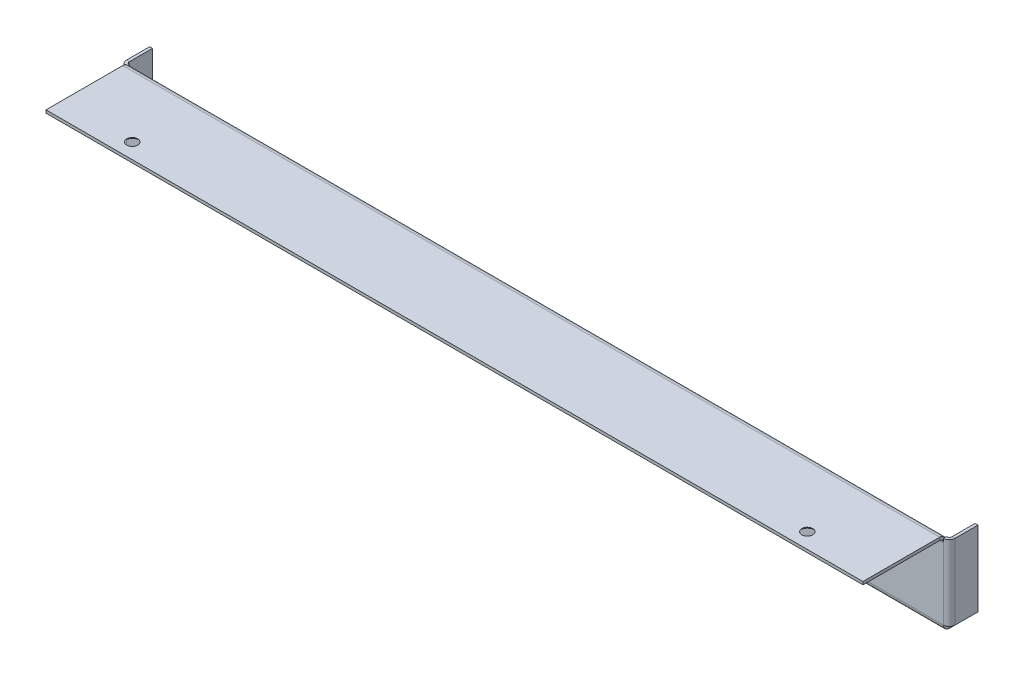
ISO-10303-21;
HEADER;
FILE_DESCRIPTION(('STEP AP214'),'2;1');
FILE_NAME('part.step','',(''),(''),'','','');
FILE_SCHEMA(('AUTOMOTIVE_DESIGN { 1 0 10303 214 1 1 1 1 }'));
ENDSEC;
DATA;
#1=APPLICATION_CONTEXT('core data for automotive mechanical design processes');
#2=APPLICATION_PROTOCOL_DEFINITION('international standard','automotive_design',2000,#1);
#3=PRODUCT_CONTEXT('',#1,'mechanical');
#4=PRODUCT('Part','Part','',(#3));
#5=PRODUCT_RELATED_PRODUCT_CATEGORY('part','',(#4));
#6=PRODUCT_DEFINITION_FORMATION('','',#4);
#7=PRODUCT_DEFINITION_CONTEXT('part definition',#1,'design');
#8=PRODUCT_DEFINITION('design','',#6,#7);
#9=PRODUCT_DEFINITION_SHAPE('','',#8);
#10=(LENGTH_UNIT() NAMED_UNIT(*) SI_UNIT(.MILLI.,.METRE.));
#11=(NAMED_UNIT(*) PLANE_ANGLE_UNIT() SI_UNIT($,.RADIAN.));
#12=(NAMED_UNIT(*) SI_UNIT($,.STERADIAN.) SOLID_ANGLE_UNIT());
#13=UNCERTAINTY_MEASURE_WITH_UNIT(LENGTH_MEASURE(1.E-05),#10,'distance_accuracy_value','');
#14=(GEOMETRIC_REPRESENTATION_CONTEXT(3) GLOBAL_UNCERTAINTY_ASSIGNED_CONTEXT((#13)) GLOBAL_UNIT_ASSIGNED_CONTEXT((#10,
#11,#12)) REPRESENTATION_CONTEXT('',''));
#15=CARTESIAN_POINT('',(0.,0.,0.));
#16=DIRECTION('',(0.,0.,1.));
#17=DIRECTION('',(1.,0.,0.));
#18=AXIS2_PLACEMENT_3D('',#15,#16,#17);
#19=CARTESIAN_POINT('',(0.,39.2,0.));
#20=DIRECTION('',(1.,0.,0.));
#21=DIRECTION('',(0.,1.,0.));
#22=AXIS2_PLACEMENT_3D('',#19,#20,#21);
#23=PLANE('',#22);
#24=DIRECTION('',(0.,0.,1.));
#25=VECTOR('',#24,1.);
#26=CARTESIAN_POINT('',(0.,39.2,-1.5));
#27=LINE('',#26,#25);
#28=CARTESIAN_POINT('',(0.,39.2,-1.5));
#29=VERTEX_POINT('',#28);
#30=CARTESIAN_POINT('',(0.,39.2,-0.872281323269019));
#31=VERTEX_POINT('',#30);
#32=EDGE_CURVE('E469',#29,#31,#27,.T.);
#33=ORIENTED_EDGE('',*,*,#32,.T.);
#34=CARTESIAN_POINT('',(0.,37.2,2.));
#35=DIRECTION('',(-1.,0.,0.));
#36=DIRECTION('',(0.,0.,1.));
#37=AXIS2_PLACEMENT_3D('',#34,#35,#36);
#38=CIRCLE('',#37,3.5);
#39=CARTESIAN_POINT('',(0.,37.2,-1.5));
#40=VERTEX_POINT('',#39);
#41=EDGE_CURVE('E264',#31,#40,#38,.T.);
#42=ORIENTED_EDGE('',*,*,#41,.T.);
#43=DIRECTION('',(0.,-1.,0.));
#44=VECTOR('',#43,1.);
#45=CARTESIAN_POINT('',(0.,0.,-1.5));
#46=LINE('',#45,#44);
#47=EDGE_CURVE('E449',#29,#40,#46,.T.);
#48=ORIENTED_EDGE('',*,*,#47,.F.);
#49=EDGE_LOOP('',(#33,#42,#48));
#50=FACE_BOUND('',#49,.T.);
#51=ADVANCED_FACE('F98',(#50),#23,.T.);
#52=CARTESIAN_POINT('',(426.,37.2,0.));
#53=DIRECTION('',(-1.,0.,0.));
#54=DIRECTION('',(0.,0.,1.));
#55=AXIS2_PLACEMENT_3D('',#52,#53,#54);
#56=PLANE('',#55);
#57=DIRECTION('',(0.,1.,0.));
#58=VECTOR('',#57,1.);
#59=CARTESIAN_POINT('',(426.,0.,-1.5));
#60=LINE('',#59,#58);
#61=CARTESIAN_POINT('',(426.,37.2,-1.50000000000001));
#62=VERTEX_POINT('',#61);
#63=CARTESIAN_POINT('',(426.,39.2,-1.50000000000001));
#64=VERTEX_POINT('',#63);
#65=EDGE_CURVE('E456',#62,#64,#60,.T.);
#66=ORIENTED_EDGE('',*,*,#65,.F.);
#67=CARTESIAN_POINT('',(426.,37.2,2.));
#68=DIRECTION('',(-1.,0.,0.));
#69=DIRECTION('',(0.,0.,1.));
#70=AXIS2_PLACEMENT_3D('',#67,#68,#69);
#71=CIRCLE('',#70,3.5);
#72=CARTESIAN_POINT('',(426.,39.2,-0.872281323269019));
#73=VERTEX_POINT('',#72);
#74=EDGE_CURVE('E121',#62,#73,#71,.F.);
#75=ORIENTED_EDGE('',*,*,#74,.T.);
#76=DIRECTION('',(0.,0.,1.));
#77=VECTOR('',#76,1.);
#78=CARTESIAN_POINT('',(426.,39.2,-1.5));
#79=LINE('',#78,#77);
#80=EDGE_CURVE('E471',#64,#73,#79,.T.);
#81=ORIENTED_EDGE('',*,*,#80,.F.);
#82=EDGE_LOOP('',(#66,#75,#81));
#83=FACE_BOUND('',#82,.T.);
#84=ADVANCED_FACE('F510',(#83),#56,.T.);
#85=CARTESIAN_POINT('',(0.,0.,-1.5));
#86=DIRECTION('',(0.,0.,-1.));
#87=DIRECTION('',(-1.,0.,0.));
#88=AXIS2_PLACEMENT_3D('',#85,#86,#87);
#89=PLANE('',#88);
#90=CARTESIAN_POINT('',(0.,0.,-1.49999999999999));
#91=VERTEX_POINT('',#90);
#92=EDGE_CURVE('E453',#40,#91,#46,.T.);
#93=ORIENTED_EDGE('',*,*,#92,.F.);
#94=DIRECTION('',(-1.,0.,0.));
#95=VECTOR('',#94,1.);
#96=CARTESIAN_POINT('',(0.,37.2,-1.5));
#97=LINE('',#96,#95);
#98=EDGE_CURVE('E266',#40,#62,#97,.F.);
#99=ORIENTED_EDGE('',*,*,#98,.T.);
#100=CARTESIAN_POINT('',(426.,0.,-1.50000000000001));
#101=VERTEX_POINT('',#100);
#102=EDGE_CURVE('E457',#101,#62,#60,.T.);
#103=ORIENTED_EDGE('',*,*,#102,.F.);
#104=DIRECTION('',(1.,0.,0.));
#105=VECTOR('',#104,1.);
#106=CARTESIAN_POINT('',(0.,0.,-1.5));
#107=LINE('',#106,#105);
#108=EDGE_CURVE('E452',#91,#101,#107,.T.);
#109=ORIENTED_EDGE('',*,*,#108,.F.);
#110=EDGE_LOOP('',(#93,#99,#103,#109));
#111=FACE_BOUND('',#110,.T.);
#112=ADVANCED_FACE('F516',(#111),#89,.T.);
#113=CARTESIAN_POINT('',(0.,0.,0.));
#114=DIRECTION('',(0.,0.,-1.));
#115=DIRECTION('',(-1.,0.,0.));
#116=AXIS2_PLACEMENT_3D('',#113,#114,#115);
#117=PLANE('',#116);
#118=DIRECTION('',(-1.,0.,0.));
#119=VECTOR('',#118,1.);
#120=CARTESIAN_POINT('',(0.,37.2,0.));
#121=LINE('',#120,#119);
#122=CARTESIAN_POINT('',(0.,37.2,0.));
#123=VERTEX_POINT('',#122);
#124=CARTESIAN_POINT('',(426.,37.2,0.));
#125=VERTEX_POINT('',#124);
#126=EDGE_CURVE('E317',#123,#125,#121,.F.);
#127=ORIENTED_EDGE('',*,*,#126,.F.);
#128=DIRECTION('',(0.,-1.,0.));
#129=VECTOR('',#128,1.);
#130=CARTESIAN_POINT('',(0.,0.,0.));
#131=LINE('',#130,#129);
#132=CARTESIAN_POINT('',(0.,0.,0.));
#133=VERTEX_POINT('',#132);
#134=EDGE_CURVE('E441',#123,#133,#131,.T.);
#135=ORIENTED_EDGE('',*,*,#134,.T.);
#136=DIRECTION('',(1.,0.,0.));
#137=VECTOR('',#136,1.);
#138=CARTESIAN_POINT('',(0.,0.,0.));
#139=LINE('',#138,#137);
#140=CARTESIAN_POINT('',(426.,0.,0.));
#141=VERTEX_POINT('',#140);
#142=EDGE_CURVE('E463',#133,#141,#139,.T.);
#143=ORIENTED_EDGE('',*,*,#142,.T.);
#144=DIRECTION('',(0.,1.,0.));
#145=VECTOR('',#144,1.);
#146=CARTESIAN_POINT('',(426.,0.,0.));
#147=LINE('',#146,#145);
#148=EDGE_CURVE('E466',#141,#125,#147,.T.);
#149=ORIENTED_EDGE('',*,*,#148,.T.);
#150=EDGE_LOOP('',(#127,#135,#143,#149));
#151=FACE_BOUND('',#150,.T.);
#152=ADVANCED_FACE('F625',(#151),#117,.F.);
#153=CARTESIAN_POINT('',(0.,0.,-3.));
#154=DIRECTION('',(0.,-1.,0.));
#155=DIRECTION('',(1.,0.,0.));
#156=AXIS2_PLACEMENT_3D('',#153,#154,#155);
#157=PLANE('',#156);
#158=DIRECTION('',(1.,0.,0.));
#159=VECTOR('',#158,1.);
#160=CARTESIAN_POINT('',(-3.,0.,-2.99999999999999));
#161=LINE('',#160,#159);
#162=CARTESIAN_POINT('',(-1.5,0.,-2.99999999999999));
#163=VERTEX_POINT('',#162);
#164=CARTESIAN_POINT('',(-3.,0.,-2.99999999999999));
#165=VERTEX_POINT('',#164);
#166=EDGE_CURVE('E399',#163,#165,#161,.F.);
#167=ORIENTED_EDGE('',*,*,#166,.F.);
#168=CARTESIAN_POINT('',(0.,0.,-3.));
#169=DIRECTION('',(0.,1.,0.));
#170=DIRECTION('',(-1.,0.,0.));
#171=AXIS2_PLACEMENT_3D('',#168,#169,#170);
#172=CIRCLE('',#171,1.5);
#173=EDGE_CURVE('E444',#91,#163,#172,.F.);
#174=ORIENTED_EDGE('',*,*,#173,.F.);
#175=DIRECTION('',(0.,0.,1.));
#176=VECTOR('',#175,1.);
#177=CARTESIAN_POINT('',(0.,0.,-1.5));
#178=LINE('',#177,#176);
#179=EDGE_CURVE('E460',#91,#133,#178,.T.);
#180=ORIENTED_EDGE('',*,*,#179,.T.);
#181=CARTESIAN_POINT('',(0.,0.,-3.));
#182=DIRECTION('',(0.,1.,0.));
#183=DIRECTION('',(-1.,0.,0.));
#184=AXIS2_PLACEMENT_3D('',#181,#182,#183);
#185=CIRCLE('',#184,3.);
#186=EDGE_CURVE('E438',#133,#165,#185,.F.);
#187=ORIENTED_EDGE('',*,*,#186,.T.);
#188=EDGE_LOOP('',(#167,#174,#180,#187));
#189=FACE_BOUND('',#188,.T.);
#190=ADVANCED_FACE('F622',(#189),#157,.T.);
#191=CARTESIAN_POINT('',(0.,39.2,-3.));
#192=DIRECTION('',(0.,-1.,0.));
#193=DIRECTION('',(1.,0.,0.));
#194=AXIS2_PLACEMENT_3D('',#191,#192,#193);
#195=PLANE('',#194);
#196=CARTESIAN_POINT('',(0.,39.2,-3.));
#197=DIRECTION('',(0.,1.,0.));
#198=DIRECTION('',(-1.,0.,0.));
#199=AXIS2_PLACEMENT_3D('',#196,#197,#198);
#200=CIRCLE('',#199,1.5);
#201=CARTESIAN_POINT('',(-1.5,39.2,-2.99999999999999));
#202=VERTEX_POINT('',#201);
#203=EDGE_CURVE('E411',#202,#29,#200,.T.);
#204=ORIENTED_EDGE('',*,*,#203,.F.);
#205=DIRECTION('',(1.,0.,0.));
#206=VECTOR('',#205,1.);
#207=CARTESIAN_POINT('',(-1.5,39.2,-2.99999999999999));
#208=LINE('',#207,#206);
#209=CARTESIAN_POINT('',(-3.,39.2,-2.99999999999999));
#210=VERTEX_POINT('',#209);
#211=EDGE_CURVE('E431',#202,#210,#208,.F.);
#212=ORIENTED_EDGE('',*,*,#211,.T.);
#213=CARTESIAN_POINT('',(0.,39.2,-3.));
#214=DIRECTION('',(0.,1.,0.));
#215=DIRECTION('',(-1.,0.,0.));
#216=AXIS2_PLACEMENT_3D('',#213,#214,#215);
#217=CIRCLE('',#216,3.);
#218=CARTESIAN_POINT('',(0.,39.2,0.));
#219=VERTEX_POINT('',#218);
#220=EDGE_CURVE('E442',#210,#219,#217,.T.);
#221=ORIENTED_EDGE('',*,*,#220,.T.);
#222=EDGE_CURVE('E113',#31,#219,#27,.T.);
#223=ORIENTED_EDGE('',*,*,#222,.F.);
#224=ORIENTED_EDGE('',*,*,#32,.F.);
#225=EDGE_LOOP('',(#204,#212,#221,#223,#224));
#226=FACE_BOUND('',#225,.T.);
#227=ADVANCED_FACE('F617',(#226),#195,.F.);
#228=CARTESIAN_POINT('',(0.,39.2,-3.));
#229=DIRECTION('',(0.,1.,0.));
#230=DIRECTION('',(-1.,0.,0.));
#231=AXIS2_PLACEMENT_3D('',#228,#229,#230);
#232=CYLINDRICAL_SURFACE('',#231,3.);
#233=EDGE_CURVE('E461',#219,#123,#131,.T.);
#234=ORIENTED_EDGE('',*,*,#233,.F.);
#235=ORIENTED_EDGE('',*,*,#220,.F.);
#236=DIRECTION('',(0.,1.,0.));
#237=VECTOR('',#236,1.);
#238=CARTESIAN_POINT('',(-3.,0.,-2.99999999999999));
#239=LINE('',#238,#237);
#240=EDGE_CURVE('E429',#210,#165,#239,.F.);
#241=ORIENTED_EDGE('',*,*,#240,.T.);
#242=ORIENTED_EDGE('',*,*,#186,.F.);
#243=ORIENTED_EDGE('',*,*,#134,.F.);
#244=EDGE_LOOP('',(#234,#235,#241,#242,#243));
#245=FACE_BOUND('',#244,.T.);
#246=ADVANCED_FACE('F614',(#245),#232,.T.);
#247=CARTESIAN_POINT('',(0.,39.2,-3.));
#248=DIRECTION('',(0.,1.,0.));
#249=DIRECTION('',(-1.,0.,0.));
#250=AXIS2_PLACEMENT_3D('',#247,#248,#249);
#251=CYLINDRICAL_SURFACE('',#250,1.5);
#252=ORIENTED_EDGE('',*,*,#47,.T.);
#253=ORIENTED_EDGE('',*,*,#92,.T.);
#254=ORIENTED_EDGE('',*,*,#173,.T.);
#255=DIRECTION('',(0.,1.,0.));
#256=VECTOR('',#255,1.);
#257=CARTESIAN_POINT('',(-1.5,0.,-2.99999999999999));
#258=LINE('',#257,#256);
#259=EDGE_CURVE('E434',#163,#202,#258,.T.);
#260=ORIENTED_EDGE('',*,*,#259,.T.);
#261=ORIENTED_EDGE('',*,*,#203,.T.);
#262=EDGE_LOOP('',(#252,#253,#254,#260,#261));
#263=FACE_BOUND('',#262,.T.);
#264=ADVANCED_FACE('F612',(#263),#251,.F.);
#265=CARTESIAN_POINT('',(-3.00000000000004,39.2,-15.));
#266=DIRECTION('',(0.,-1.,0.));
#267=DIRECTION('',(0.,0.,-1.));
#268=AXIS2_PLACEMENT_3D('',#265,#266,#267);
#269=PLANE('',#268);
#270=ORIENTED_EDGE('',*,*,#211,.F.);
#271=DIRECTION('',(0.,0.,1.));
#272=VECTOR('',#271,1.);
#273=CARTESIAN_POINT('',(-1.50000000000004,39.2,-15.));
#274=LINE('',#273,#272);
#275=CARTESIAN_POINT('',(-1.50000000000004,39.2,-15.));
#276=VERTEX_POINT('',#275);
#277=EDGE_CURVE('E427',#202,#276,#274,.F.);
#278=ORIENTED_EDGE('',*,*,#277,.T.);
#279=DIRECTION('',(1.,0.,0.));
#280=VECTOR('',#279,1.);
#281=CARTESIAN_POINT('',(-3.00000000000004,39.2,-15.));
#282=LINE('',#281,#280);
#283=CARTESIAN_POINT('',(-3.00000000000004,39.2,-15.));
#284=VERTEX_POINT('',#283);
#285=EDGE_CURVE('E408',#284,#276,#282,.T.);
#286=ORIENTED_EDGE('',*,*,#285,.F.);
#287=DIRECTION('',(0.,0.,-1.));
#288=VECTOR('',#287,1.);
#289=CARTESIAN_POINT('',(-2.99999999999999,39.2,0.));
#290=LINE('',#289,#288);
#291=EDGE_CURVE('E420',#210,#284,#290,.T.);
#292=ORIENTED_EDGE('',*,*,#291,.F.);
#293=EDGE_LOOP('',(#270,#278,#286,#292));
#294=FACE_BOUND('',#293,.T.);
#295=ADVANCED_FACE('F605',(#294),#269,.F.);
#296=CARTESIAN_POINT('',(-2.99999999999999,0.,-1.49999999999999));
#297=DIRECTION('',(0.,1.,0.));
#298=DIRECTION('',(0.,0.,1.));
#299=AXIS2_PLACEMENT_3D('',#296,#297,#298);
#300=PLANE('',#299);
#301=ORIENTED_EDGE('',*,*,#166,.T.);
#302=DIRECTION('',(0.,0.,1.));
#303=VECTOR('',#302,1.);
#304=CARTESIAN_POINT('',(-2.99999999999999,0.,0.));
#305=LINE('',#304,#303);
#306=CARTESIAN_POINT('',(-3.00000000000004,0.,-15.));
#307=VERTEX_POINT('',#306);
#308=EDGE_CURVE('E415',#307,#165,#305,.T.);
#309=ORIENTED_EDGE('',*,*,#308,.F.);
#310=DIRECTION('',(1.,0.,0.));
#311=VECTOR('',#310,1.);
#312=CARTESIAN_POINT('',(-3.00000000000004,0.,-15.));
#313=LINE('',#312,#311);
#314=CARTESIAN_POINT('',(-1.50000000000004,0.,-15.));
#315=VERTEX_POINT('',#314);
#316=EDGE_CURVE('E412',#307,#315,#313,.T.);
#317=ORIENTED_EDGE('',*,*,#316,.T.);
#318=DIRECTION('',(0.,0.,-1.));
#319=VECTOR('',#318,1.);
#320=CARTESIAN_POINT('',(-1.49999999999999,0.,-1.5));
#321=LINE('',#320,#319);
#322=EDGE_CURVE('E422',#315,#163,#321,.F.);
#323=ORIENTED_EDGE('',*,*,#322,.T.);
#324=EDGE_LOOP('',(#301,#309,#317,#323));
#325=FACE_BOUND('',#324,.T.);
#326=ADVANCED_FACE('F598',(#325),#300,.F.);
#327=CARTESIAN_POINT('',(-2.99999999999999,0.,0.));
#328=DIRECTION('',(1.,0.,0.));
#329=DIRECTION('',(0.,0.,-1.));
#330=AXIS2_PLACEMENT_3D('',#327,#328,#329);
#331=PLANE('',#330);
#332=ORIENTED_EDGE('',*,*,#240,.F.);
#333=ORIENTED_EDGE('',*,*,#291,.T.);
#334=DIRECTION('',(0.,-1.,0.));
#335=VECTOR('',#334,1.);
#336=CARTESIAN_POINT('',(-3.00000000000004,0.,-15.));
#337=LINE('',#336,#335);
#338=EDGE_CURVE('E418',#284,#307,#337,.T.);
#339=ORIENTED_EDGE('',*,*,#338,.T.);
#340=ORIENTED_EDGE('',*,*,#308,.T.);
#341=EDGE_LOOP('',(#332,#333,#339,#340));
#342=FACE_BOUND('',#341,.T.);
#343=ADVANCED_FACE('F594',(#342),#331,.F.);
#344=CARTESIAN_POINT('',(-1.49999999999999,0.,0.));
#345=DIRECTION('',(1.,0.,0.));
#346=DIRECTION('',(0.,0.,-1.));
#347=AXIS2_PLACEMENT_3D('',#344,#345,#346);
#348=PLANE('',#347);
#349=ORIENTED_EDGE('',*,*,#277,.F.);
#350=ORIENTED_EDGE('',*,*,#259,.F.);
#351=ORIENTED_EDGE('',*,*,#322,.F.);
#352=DIRECTION('',(0.,1.,0.));
#353=VECTOR('',#352,1.);
#354=CARTESIAN_POINT('',(-1.50000000000004,0.,-15.));
#355=LINE('',#354,#353);
#356=EDGE_CURVE('E425',#276,#315,#355,.F.);
#357=ORIENTED_EDGE('',*,*,#356,.F.);
#358=EDGE_LOOP('',(#349,#350,#351,#357));
#359=FACE_BOUND('',#358,.T.);
#360=ADVANCED_FACE('F597',(#359),#348,.T.);
#361=CARTESIAN_POINT('',(-3.00000000000004,0.,-15.));
#362=DIRECTION('',(0.,0.,1.));
#363=DIRECTION('',(1.,0.,0.));
#364=AXIS2_PLACEMENT_3D('',#361,#362,#363);
#365=PLANE('',#364);
#366=ORIENTED_EDGE('',*,*,#356,.T.);
#367=ORIENTED_EDGE('',*,*,#316,.F.);
#368=ORIENTED_EDGE('',*,*,#338,.F.);
#369=ORIENTED_EDGE('',*,*,#285,.T.);
#370=EDGE_LOOP('',(#366,#367,#368,#369));
#371=FACE_BOUND('',#370,.T.);
#372=ADVANCED_FACE('F589',(#371),#365,.F.);
#373=CARTESIAN_POINT('',(426.,0.,-3.));
#374=DIRECTION('',(1.,0.,0.));
#375=DIRECTION('',(0.,1.,0.));
#376=AXIS2_PLACEMENT_3D('',#373,#374,#375);
#377=PLANE('',#376);
#378=DIRECTION('',(0.,1.,0.));
#379=VECTOR('',#378,1.);
#380=CARTESIAN_POINT('',(426.,-3.,-2.99999999999999));
#381=LINE('',#380,#379);
#382=CARTESIAN_POINT('',(426.,-1.5,-3.));
#383=VERTEX_POINT('',#382);
#384=CARTESIAN_POINT('',(426.,-3.,-2.99999999999999));
#385=VERTEX_POINT('',#384);
#386=EDGE_CURVE('E357',#383,#385,#381,.F.);
#387=ORIENTED_EDGE('',*,*,#386,.F.);
#388=CARTESIAN_POINT('',(426.,0.,-3.));
#389=DIRECTION('',(-1.,0.,0.));
#390=DIRECTION('',(0.,-1.,0.));
#391=AXIS2_PLACEMENT_3D('',#388,#389,#390);
#392=CIRCLE('',#391,1.50000000000002);
#393=EDGE_CURVE('E403',#101,#383,#392,.F.);
#394=ORIENTED_EDGE('',*,*,#393,.F.);
#395=DIRECTION('',(0.,0.,1.));
#396=VECTOR('',#395,1.);
#397=CARTESIAN_POINT('',(426.,0.,-1.5));
#398=LINE('',#397,#396);
#399=EDGE_CURVE('E474',#101,#141,#398,.T.);
#400=ORIENTED_EDGE('',*,*,#399,.T.);
#401=CARTESIAN_POINT('',(426.,0.,-3.));
#402=DIRECTION('',(-1.,0.,0.));
#403=DIRECTION('',(0.,-1.,0.));
#404=AXIS2_PLACEMENT_3D('',#401,#402,#403);
#405=CIRCLE('',#404,3.00000000000001);
#406=EDGE_CURVE('E396',#141,#385,#405,.F.);
#407=ORIENTED_EDGE('',*,*,#406,.T.);
#408=EDGE_LOOP('',(#387,#394,#400,#407));
#409=FACE_BOUND('',#408,.T.);
#410=ADVANCED_FACE('F586',(#409),#377,.T.);
#411=CARTESIAN_POINT('',(0.,0.,-3.));
#412=DIRECTION('',(1.,0.,0.));
#413=DIRECTION('',(0.,1.,0.));
#414=AXIS2_PLACEMENT_3D('',#411,#412,#413);
#415=PLANE('',#414);
#416=CARTESIAN_POINT('',(0.,0.,-3.));
#417=DIRECTION('',(-1.,0.,0.));
#418=DIRECTION('',(0.,-1.,0.));
#419=AXIS2_PLACEMENT_3D('',#416,#417,#418);
#420=CIRCLE('',#419,1.50000000000002);
#421=CARTESIAN_POINT('',(0.,-1.50000000000003,-3.));
#422=VERTEX_POINT('',#421);
#423=EDGE_CURVE('E369',#422,#91,#420,.T.);
#424=ORIENTED_EDGE('',*,*,#423,.F.);
#425=DIRECTION('',(0.,1.,0.));
#426=VECTOR('',#425,1.);
#427=CARTESIAN_POINT('',(0.,-1.5,-3.));
#428=LINE('',#427,#426);
#429=CARTESIAN_POINT('',(0.,-3.,-2.99999999999999));
#430=VERTEX_POINT('',#429);
#431=EDGE_CURVE('E389',#422,#430,#428,.F.);
#432=ORIENTED_EDGE('',*,*,#431,.T.);
#433=CARTESIAN_POINT('',(0.,0.,-3.));
#434=DIRECTION('',(-1.,0.,0.));
#435=DIRECTION('',(0.,-1.,0.));
#436=AXIS2_PLACEMENT_3D('',#433,#434,#435);
#437=CIRCLE('',#436,3.00000000000001);
#438=EDGE_CURVE('E400',#430,#133,#437,.T.);
#439=ORIENTED_EDGE('',*,*,#438,.T.);
#440=ORIENTED_EDGE('',*,*,#179,.F.);
#441=EDGE_LOOP('',(#424,#432,#439,#440));
#442=FACE_BOUND('',#441,.T.);
#443=ADVANCED_FACE('F581',(#442),#415,.F.);
#444=CARTESIAN_POINT('',(0.,0.,-3.));
#445=DIRECTION('',(-1.,0.,0.));
#446=DIRECTION('',(0.,-1.,0.));
#447=AXIS2_PLACEMENT_3D('',#444,#445,#446);
#448=CYLINDRICAL_SURFACE('',#447,3.00000000000001);
#449=ORIENTED_EDGE('',*,*,#142,.F.);
#450=ORIENTED_EDGE('',*,*,#438,.F.);
#451=DIRECTION('',(-1.,0.,0.));
#452=VECTOR('',#451,1.);
#453=CARTESIAN_POINT('',(426.,-3.,-2.99999999999999));
#454=LINE('',#453,#452);
#455=EDGE_CURVE('E387',#430,#385,#454,.F.);
#456=ORIENTED_EDGE('',*,*,#455,.T.);
#457=ORIENTED_EDGE('',*,*,#406,.F.);
#458=EDGE_LOOP('',(#449,#450,#456,#457));
#459=FACE_BOUND('',#458,.T.);
#460=ADVANCED_FACE('F578',(#459),#448,.T.);
#461=CARTESIAN_POINT('',(0.,0.,-3.));
#462=DIRECTION('',(-1.,0.,0.));
#463=DIRECTION('',(0.,-1.,0.));
#464=AXIS2_PLACEMENT_3D('',#461,#462,#463);
#465=CYLINDRICAL_SURFACE('',#464,1.50000000000002);
#466=ORIENTED_EDGE('',*,*,#108,.T.);
#467=ORIENTED_EDGE('',*,*,#393,.T.);
#468=DIRECTION('',(-1.,0.,0.));
#469=VECTOR('',#468,1.);
#470=CARTESIAN_POINT('',(426.,-1.5,-2.99999999999999));
#471=LINE('',#470,#469);
#472=EDGE_CURVE('E392',#383,#422,#471,.T.);
#473=ORIENTED_EDGE('',*,*,#472,.T.);
#474=ORIENTED_EDGE('',*,*,#423,.T.);
#475=EDGE_LOOP('',(#466,#467,#473,#474));
#476=FACE_BOUND('',#475,.T.);
#477=ADVANCED_FACE('F576',(#476),#465,.F.);
#478=CARTESIAN_POINT('',(0.,-3.00000000000004,-15.));
#479=DIRECTION('',(1.,0.,0.));
#480=DIRECTION('',(0.,0.,-1.));
#481=AXIS2_PLACEMENT_3D('',#478,#479,#480);
#482=PLANE('',#481);
#483=ORIENTED_EDGE('',*,*,#431,.F.);
#484=DIRECTION('',(0.,0.,1.));
#485=VECTOR('',#484,1.);
#486=CARTESIAN_POINT('',(0.,-1.50000000000004,-15.));
#487=LINE('',#486,#485);
#488=CARTESIAN_POINT('',(0.,-1.50000000000004,-15.));
#489=VERTEX_POINT('',#488);
#490=EDGE_CURVE('E385',#422,#489,#487,.F.);
#491=ORIENTED_EDGE('',*,*,#490,.T.);
#492=DIRECTION('',(0.,1.,0.));
#493=VECTOR('',#492,1.);
#494=CARTESIAN_POINT('',(0.,-3.00000000000004,-15.));
#495=LINE('',#494,#493);
#496=CARTESIAN_POINT('',(0.,-3.00000000000004,-15.));
#497=VERTEX_POINT('',#496);
#498=EDGE_CURVE('E366',#497,#489,#495,.T.);
#499=ORIENTED_EDGE('',*,*,#498,.F.);
#500=DIRECTION('',(0.,0.,-1.));
#501=VECTOR('',#500,1.);
#502=CARTESIAN_POINT('',(0.,-2.99999999999999,0.));
#503=LINE('',#502,#501);
#504=EDGE_CURVE('E378',#430,#497,#503,.T.);
#505=ORIENTED_EDGE('',*,*,#504,.F.);
#506=EDGE_LOOP('',(#483,#491,#499,#505));
#507=FACE_BOUND('',#506,.T.);
#508=ADVANCED_FACE('F569',(#507),#482,.F.);
#509=CARTESIAN_POINT('',(426.,-2.99999999999999,-1.49999999999999));
#510=DIRECTION('',(-1.,0.,0.));
#511=DIRECTION('',(0.,-1.,0.));
#512=AXIS2_PLACEMENT_3D('',#509,#510,#511);
#513=PLANE('',#512);
#514=ORIENTED_EDGE('',*,*,#386,.T.);
#515=DIRECTION('',(0.,0.,1.));
#516=VECTOR('',#515,1.);
#517=CARTESIAN_POINT('',(426.,-2.99999999999999,0.));
#518=LINE('',#517,#516);
#519=CARTESIAN_POINT('',(426.,-3.00000000000004,-15.));
#520=VERTEX_POINT('',#519);
#521=EDGE_CURVE('E373',#520,#385,#518,.T.);
#522=ORIENTED_EDGE('',*,*,#521,.F.);
#523=DIRECTION('',(0.,1.,0.));
#524=VECTOR('',#523,1.);
#525=CARTESIAN_POINT('',(426.,-3.00000000000004,-15.));
#526=LINE('',#525,#524);
#527=CARTESIAN_POINT('',(426.,-1.50000000000004,-15.));
#528=VERTEX_POINT('',#527);
#529=EDGE_CURVE('E370',#520,#528,#526,.T.);
#530=ORIENTED_EDGE('',*,*,#529,.T.);
#531=DIRECTION('',(0.,0.,-1.));
#532=VECTOR('',#531,1.);
#533=CARTESIAN_POINT('',(426.,-1.49999999999999,-1.5));
#534=LINE('',#533,#532);
#535=EDGE_CURVE('E380',#528,#383,#534,.F.);
#536=ORIENTED_EDGE('',*,*,#535,.T.);
#537=EDGE_LOOP('',(#514,#522,#530,#536));
#538=FACE_BOUND('',#537,.T.);
#539=ADVANCED_FACE('F562',(#538),#513,.F.);
#540=CARTESIAN_POINT('',(0.,-2.99999999999999,0.));
#541=DIRECTION('',(0.,1.,0.));
#542=DIRECTION('',(0.,0.,1.));
#543=AXIS2_PLACEMENT_3D('',#540,#541,#542);
#544=PLANE('',#543);
#545=ORIENTED_EDGE('',*,*,#455,.F.);
#546=ORIENTED_EDGE('',*,*,#504,.T.);
#547=DIRECTION('',(1.,0.,0.));
#548=VECTOR('',#547,1.);
#549=CARTESIAN_POINT('',(0.,-3.00000000000004,-15.));
#550=LINE('',#549,#548);
#551=EDGE_CURVE('E376',#497,#520,#550,.T.);
#552=ORIENTED_EDGE('',*,*,#551,.T.);
#553=ORIENTED_EDGE('',*,*,#521,.T.);
#554=EDGE_LOOP('',(#545,#546,#552,#553));
#555=FACE_BOUND('',#554,.T.);
#556=ADVANCED_FACE('F558',(#555),#544,.F.);
#557=CARTESIAN_POINT('',(0.,-1.49999999999999,0.));
#558=DIRECTION('',(0.,1.,0.));
#559=DIRECTION('',(0.,0.,1.));
#560=AXIS2_PLACEMENT_3D('',#557,#558,#559);
#561=PLANE('',#560);
#562=ORIENTED_EDGE('',*,*,#490,.F.);
#563=ORIENTED_EDGE('',*,*,#472,.F.);
#564=ORIENTED_EDGE('',*,*,#535,.F.);
#565=DIRECTION('',(-1.,0.,0.));
#566=VECTOR('',#565,1.);
#567=CARTESIAN_POINT('',(426.,-1.50000000000004,-15.));
#568=LINE('',#567,#566);
#569=EDGE_CURVE('E383',#489,#528,#568,.F.);
#570=ORIENTED_EDGE('',*,*,#569,.F.);
#571=EDGE_LOOP('',(#562,#563,#564,#570));
#572=FACE_BOUND('',#571,.T.);
#573=ADVANCED_FACE('F561',(#572),#561,.T.);
#574=CARTESIAN_POINT('',(426.,-3.00000000000004,-15.));
#575=DIRECTION('',(0.,0.,1.));
#576=DIRECTION('',(0.,-1.,0.));
#577=AXIS2_PLACEMENT_3D('',#574,#575,#576);
#578=PLANE('',#577);
#579=ORIENTED_EDGE('',*,*,#569,.T.);
#580=ORIENTED_EDGE('',*,*,#529,.F.);
#581=ORIENTED_EDGE('',*,*,#551,.F.);
#582=ORIENTED_EDGE('',*,*,#498,.T.);
#583=EDGE_LOOP('',(#579,#580,#581,#582));
#584=FACE_BOUND('',#583,.T.);
#585=ADVANCED_FACE('F553',(#584),#578,.F.);
#586=CARTESIAN_POINT('',(426.,39.2,-3.00000000000001));
#587=DIRECTION('',(0.,1.,0.));
#588=DIRECTION('',(0.,0.,1.));
#589=AXIS2_PLACEMENT_3D('',#586,#587,#588);
#590=PLANE('',#589);
#591=DIRECTION('',(-1.,0.,0.));
#592=VECTOR('',#591,1.);
#593=CARTESIAN_POINT('',(429.,39.2,-3.));
#594=LINE('',#593,#592);
#595=CARTESIAN_POINT('',(427.5,39.2,-3.));
#596=VERTEX_POINT('',#595);
#597=CARTESIAN_POINT('',(429.,39.2,-3.));
#598=VERTEX_POINT('',#597);
#599=EDGE_CURVE('E323',#596,#598,#594,.F.);
#600=ORIENTED_EDGE('',*,*,#599,.F.);
#601=CARTESIAN_POINT('',(426.,39.2,-3.00000000000001));
#602=DIRECTION('',(0.,-1.,0.));
#603=DIRECTION('',(0.,0.,-1.));
#604=AXIS2_PLACEMENT_3D('',#601,#602,#603);
#605=CIRCLE('',#604,1.5);
#606=EDGE_CURVE('E361',#64,#596,#605,.F.);
#607=ORIENTED_EDGE('',*,*,#606,.F.);
#608=ORIENTED_EDGE('',*,*,#80,.T.);
#609=CARTESIAN_POINT('',(426.,39.2,0.));
#610=VERTEX_POINT('',#609);
#611=EDGE_CURVE('E473',#73,#610,#79,.T.);
#612=ORIENTED_EDGE('',*,*,#611,.T.);
#613=CARTESIAN_POINT('',(426.,39.2,-3.00000000000001));
#614=DIRECTION('',(0.,-1.,0.));
#615=DIRECTION('',(0.,0.,-1.));
#616=AXIS2_PLACEMENT_3D('',#613,#614,#615);
#617=CIRCLE('',#616,3.);
#618=EDGE_CURVE('E354',#610,#598,#617,.F.);
#619=ORIENTED_EDGE('',*,*,#618,.T.);
#620=EDGE_LOOP('',(#600,#607,#608,#612,#619));
#621=FACE_BOUND('',#620,.T.);
#622=ADVANCED_FACE('F550',(#621),#590,.T.);
#623=CARTESIAN_POINT('',(426.,0.,-3.00000000000001));
#624=DIRECTION('',(0.,1.,0.));
#625=DIRECTION('',(0.,0.,1.));
#626=AXIS2_PLACEMENT_3D('',#623,#624,#625);
#627=PLANE('',#626);
#628=CARTESIAN_POINT('',(426.,0.,-3.00000000000001));
#629=DIRECTION('',(0.,-1.,0.));
#630=DIRECTION('',(0.,0.,-1.));
#631=AXIS2_PLACEMENT_3D('',#628,#629,#630);
#632=CIRCLE('',#631,1.5);
#633=CARTESIAN_POINT('',(427.5,0.,-3.));
#634=VERTEX_POINT('',#633);
#635=EDGE_CURVE('E327',#634,#101,#632,.T.);
#636=ORIENTED_EDGE('',*,*,#635,.F.);
#637=DIRECTION('',(-1.,0.,0.));
#638=VECTOR('',#637,1.);
#639=CARTESIAN_POINT('',(427.5,0.,-3.));
#640=LINE('',#639,#638);
#641=CARTESIAN_POINT('',(429.,0.,-3.));
#642=VERTEX_POINT('',#641);
#643=EDGE_CURVE('E347',#634,#642,#640,.F.);
#644=ORIENTED_EDGE('',*,*,#643,.T.);
#645=CARTESIAN_POINT('',(426.,0.,-3.00000000000001));
#646=DIRECTION('',(0.,-1.,0.));
#647=DIRECTION('',(0.,0.,-1.));
#648=AXIS2_PLACEMENT_3D('',#645,#646,#647);
#649=CIRCLE('',#648,3.);
#650=EDGE_CURVE('E358',#642,#141,#649,.T.);
#651=ORIENTED_EDGE('',*,*,#650,.T.);
#652=ORIENTED_EDGE('',*,*,#399,.F.);
#653=EDGE_LOOP('',(#636,#644,#651,#652));
#654=FACE_BOUND('',#653,.T.);
#655=ADVANCED_FACE('F545',(#654),#627,.F.);
#656=CARTESIAN_POINT('',(426.,0.,-3.00000000000001));
#657=DIRECTION('',(0.,-1.,0.));
#658=DIRECTION('',(1.,0.,0.));
#659=AXIS2_PLACEMENT_3D('',#656,#657,#658);
#660=CYLINDRICAL_SURFACE('',#659,3.);
#661=ORIENTED_EDGE('',*,*,#148,.F.);
#662=ORIENTED_EDGE('',*,*,#650,.F.);
#663=DIRECTION('',(0.,-1.,0.));
#664=VECTOR('',#663,1.);
#665=CARTESIAN_POINT('',(429.,39.2,-3.));
#666=LINE('',#665,#664);
#667=EDGE_CURVE('E345',#642,#598,#666,.F.);
#668=ORIENTED_EDGE('',*,*,#667,.T.);
#669=ORIENTED_EDGE('',*,*,#618,.F.);
#670=DIRECTION('',(0.,1.,0.));
#671=VECTOR('',#670,1.);
#672=CARTESIAN_POINT('',(426.,37.2,0.));
#673=LINE('',#672,#671);
#674=EDGE_CURVE('E313',#125,#610,#673,.T.);
#675=ORIENTED_EDGE('',*,*,#674,.F.);
#676=EDGE_LOOP('',(#661,#662,#668,#669,#675));
#677=FACE_BOUND('',#676,.T.);
#678=ADVANCED_FACE('F542',(#677),#660,.T.);
#679=CARTESIAN_POINT('',(426.,0.,-3.00000000000001));
#680=DIRECTION('',(0.,-1.,0.));
#681=DIRECTION('',(1.,0.,0.));
#682=AXIS2_PLACEMENT_3D('',#679,#680,#681);
#683=CYLINDRICAL_SURFACE('',#682,1.5);
#684=ORIENTED_EDGE('',*,*,#102,.T.);
#685=ORIENTED_EDGE('',*,*,#65,.T.);
#686=ORIENTED_EDGE('',*,*,#606,.T.);
#687=DIRECTION('',(0.,-1.,0.));
#688=VECTOR('',#687,1.);
#689=CARTESIAN_POINT('',(427.5,39.2,-3.));
#690=LINE('',#689,#688);
#691=EDGE_CURVE('E350',#596,#634,#690,.T.);
#692=ORIENTED_EDGE('',*,*,#691,.T.);
#693=ORIENTED_EDGE('',*,*,#635,.T.);
#694=EDGE_LOOP('',(#684,#685,#686,#692,#693));
#695=FACE_BOUND('',#694,.T.);
#696=ADVANCED_FACE('F540',(#695),#683,.F.);
#697=CARTESIAN_POINT('',(429.,0.,-15.));
#698=DIRECTION('',(0.,1.,0.));
#699=DIRECTION('',(0.,0.,1.));
#700=AXIS2_PLACEMENT_3D('',#697,#698,#699);
#701=PLANE('',#700);
#702=ORIENTED_EDGE('',*,*,#643,.F.);
#703=DIRECTION('',(0.,0.,1.));
#704=VECTOR('',#703,1.);
#705=CARTESIAN_POINT('',(427.5,0.,-15.));
#706=LINE('',#705,#704);
#707=CARTESIAN_POINT('',(427.5,0.,-15.));
#708=VERTEX_POINT('',#707);
#709=EDGE_CURVE('E343',#634,#708,#706,.F.);
#710=ORIENTED_EDGE('',*,*,#709,.T.);
#711=DIRECTION('',(-1.,0.,0.));
#712=VECTOR('',#711,1.);
#713=CARTESIAN_POINT('',(429.,0.,-15.));
#714=LINE('',#713,#712);
#715=CARTESIAN_POINT('',(429.,0.,-15.));
#716=VERTEX_POINT('',#715);
#717=EDGE_CURVE('E324',#716,#708,#714,.T.);
#718=ORIENTED_EDGE('',*,*,#717,.F.);
#719=DIRECTION('',(0.,0.,-1.));
#720=VECTOR('',#719,1.);
#721=CARTESIAN_POINT('',(429.,0.,1.75692243863907E-12));
#722=LINE('',#721,#720);
#723=EDGE_CURVE('E336',#642,#716,#722,.T.);
#724=ORIENTED_EDGE('',*,*,#723,.F.);
#725=EDGE_LOOP('',(#702,#710,#718,#724));
#726=FACE_BOUND('',#725,.T.);
#727=ADVANCED_FACE('F532',(#726),#701,.F.);
#728=CARTESIAN_POINT('',(429.,39.2,-1.49999999999999));
#729=DIRECTION('',(0.,-1.,0.));
#730=DIRECTION('',(0.,0.,-1.));
#731=AXIS2_PLACEMENT_3D('',#728,#729,#730);
#732=PLANE('',#731);
#733=ORIENTED_EDGE('',*,*,#599,.T.);
#734=DIRECTION('',(0.,0.,1.));
#735=VECTOR('',#734,1.);
#736=CARTESIAN_POINT('',(429.,39.2,1.73677394671068E-12));
#737=LINE('',#736,#735);
#738=CARTESIAN_POINT('',(429.,39.2,-15.));
#739=VERTEX_POINT('',#738);
#740=EDGE_CURVE('E331',#739,#598,#737,.T.);
#741=ORIENTED_EDGE('',*,*,#740,.F.);
#742=DIRECTION('',(-1.,0.,0.));
#743=VECTOR('',#742,1.);
#744=CARTESIAN_POINT('',(429.,39.2,-15.));
#745=LINE('',#744,#743);
#746=CARTESIAN_POINT('',(427.5,39.2,-15.));
#747=VERTEX_POINT('',#746);
#748=EDGE_CURVE('E328',#739,#747,#745,.T.);
#749=ORIENTED_EDGE('',*,*,#748,.T.);
#750=DIRECTION('',(0.,0.,-1.));
#751=VECTOR('',#750,1.);
#752=CARTESIAN_POINT('',(427.5,39.2,-1.5));
#753=LINE('',#752,#751);
#754=EDGE_CURVE('E338',#747,#596,#753,.F.);
#755=ORIENTED_EDGE('',*,*,#754,.T.);
#756=EDGE_LOOP('',(#733,#741,#749,#755));
#757=FACE_BOUND('',#756,.T.);
#758=ADVANCED_FACE('F524',(#757),#732,.F.);
#759=CARTESIAN_POINT('',(429.,0.,1.75692243863907E-12));
#760=DIRECTION('',(-1.,0.,0.));
#761=DIRECTION('',(0.,0.,1.));
#762=AXIS2_PLACEMENT_3D('',#759,#760,#761);
#763=PLANE('',#762);
#764=ORIENTED_EDGE('',*,*,#667,.F.);
#765=ORIENTED_EDGE('',*,*,#723,.T.);
#766=DIRECTION('',(0.,1.,0.));
#767=VECTOR('',#766,1.);
#768=CARTESIAN_POINT('',(429.,0.,-15.));
#769=LINE('',#768,#767);
#770=EDGE_CURVE('E334',#716,#739,#769,.T.);
#771=ORIENTED_EDGE('',*,*,#770,.T.);
#772=ORIENTED_EDGE('',*,*,#740,.T.);
#773=EDGE_LOOP('',(#764,#765,#771,#772));
#774=FACE_BOUND('',#773,.T.);
#775=ADVANCED_FACE('F520',(#774),#763,.F.);
#776=CARTESIAN_POINT('',(427.5,0.,1.7516852166308E-12));
#777=DIRECTION('',(-1.,0.,0.));
#778=DIRECTION('',(0.,0.,1.));
#779=AXIS2_PLACEMENT_3D('',#776,#777,#778);
#780=PLANE('',#779);
#781=ORIENTED_EDGE('',*,*,#709,.F.);
#782=ORIENTED_EDGE('',*,*,#691,.F.);
#783=ORIENTED_EDGE('',*,*,#754,.F.);
#784=DIRECTION('',(0.,-1.,0.));
#785=VECTOR('',#784,1.);
#786=CARTESIAN_POINT('',(427.5,39.2,-15.));
#787=LINE('',#786,#785);
#788=EDGE_CURVE('E341',#708,#747,#787,.F.);
#789=ORIENTED_EDGE('',*,*,#788,.F.);
#790=EDGE_LOOP('',(#781,#782,#783,#789));
#791=FACE_BOUND('',#790,.T.);
#792=ADVANCED_FACE('F523',(#791),#780,.T.);
#793=CARTESIAN_POINT('',(429.,39.2,-15.));
#794=DIRECTION('',(0.,0.,1.));
#795=DIRECTION('',(1.,0.,0.));
#796=AXIS2_PLACEMENT_3D('',#793,#794,#795);
#797=PLANE('',#796);
#798=ORIENTED_EDGE('',*,*,#788,.T.);
#799=ORIENTED_EDGE('',*,*,#748,.F.);
#800=ORIENTED_EDGE('',*,*,#770,.F.);
#801=ORIENTED_EDGE('',*,*,#717,.T.);
#802=EDGE_LOOP('',(#798,#799,#800,#801));
#803=FACE_BOUND('',#802,.T.);
#804=ADVANCED_FACE('F528',(#803),#797,.F.);
#805=CARTESIAN_POINT('',(426.,37.2,2.));
#806=DIRECTION('',(1.,0.,0.));
#807=DIRECTION('',(0.,0.,-1.));
#808=AXIS2_PLACEMENT_3D('',#805,#806,#807);
#809=PLANE('',#808);
#810=ORIENTED_EDGE('',*,*,#611,.F.);
#811=CARTESIAN_POINT('',(426.,40.7,1.99999999999999));
#812=VERTEX_POINT('',#811);
#813=EDGE_CURVE('E312',#73,#812,#71,.F.);
#814=ORIENTED_EDGE('',*,*,#813,.T.);
#815=DIRECTION('',(0.,1.,0.));
#816=VECTOR('',#815,1.);
#817=CARTESIAN_POINT('',(426.,39.2,1.99999999999999));
#818=LINE('',#817,#816);
#819=CARTESIAN_POINT('',(426.,39.2,1.99999999999999));
#820=VERTEX_POINT('',#819);
#821=EDGE_CURVE('E1024',#820,#812,#818,.T.);
#822=ORIENTED_EDGE('',*,*,#821,.F.);
#823=CARTESIAN_POINT('',(426.,37.2,2.));
#824=DIRECTION('',(-1.,0.,0.));
#825=DIRECTION('',(0.,0.,1.));
#826=AXIS2_PLACEMENT_3D('',#823,#824,#825);
#827=CIRCLE('',#826,2.);
#828=EDGE_CURVE('E267',#125,#820,#827,.F.);
#829=ORIENTED_EDGE('',*,*,#828,.F.);
#830=ORIENTED_EDGE('',*,*,#674,.T.);
#831=EDGE_LOOP('',(#810,#814,#822,#829,#830));
#832=FACE_BOUND('',#831,.T.);
#833=ADVANCED_FACE('F536',(#832),#809,.T.);
#834=CARTESIAN_POINT('',(0.,37.2,2.));
#835=DIRECTION('',(1.,0.,0.));
#836=DIRECTION('',(0.,0.,-1.));
#837=AXIS2_PLACEMENT_3D('',#834,#835,#836);
#838=PLANE('',#837);
#839=CARTESIAN_POINT('',(0.,40.7,1.99999999999999));
#840=VERTEX_POINT('',#839);
#841=EDGE_CURVE('E256',#840,#31,#38,.T.);
#842=ORIENTED_EDGE('',*,*,#841,.T.);
#843=ORIENTED_EDGE('',*,*,#222,.T.);
#844=ORIENTED_EDGE('',*,*,#233,.T.);
#845=CARTESIAN_POINT('',(0.,37.2,2.));
#846=DIRECTION('',(-1.,0.,0.));
#847=DIRECTION('',(0.,0.,1.));
#848=AXIS2_PLACEMENT_3D('',#845,#846,#847);
#849=CIRCLE('',#848,2.);
#850=CARTESIAN_POINT('',(0.,39.2,1.99999999999999));
#851=VERTEX_POINT('',#850);
#852=EDGE_CURVE('E275',#851,#123,#849,.T.);
#853=ORIENTED_EDGE('',*,*,#852,.F.);
#854=DIRECTION('',(0.,1.,0.));
#855=VECTOR('',#854,1.);
#856=CARTESIAN_POINT('',(0.,39.2,1.99999999999999));
#857=LINE('',#856,#855);
#858=EDGE_CURVE('E271',#851,#840,#857,.T.);
#859=ORIENTED_EDGE('',*,*,#858,.T.);
#860=EDGE_LOOP('',(#842,#843,#844,#853,#859));
#861=FACE_BOUND('',#860,.T.);
#862=ADVANCED_FACE('F272',(#861),#838,.F.);
#863=CARTESIAN_POINT('',(0.,37.2,2.));
#864=DIRECTION('',(-1.,0.,0.));
#865=DIRECTION('',(0.,1.,0.));
#866=AXIS2_PLACEMENT_3D('',#863,#864,#865);
#867=CYLINDRICAL_SURFACE('',#866,3.5);
#868=ORIENTED_EDGE('',*,*,#98,.F.);
#869=ORIENTED_EDGE('',*,*,#41,.F.);
#870=ORIENTED_EDGE('',*,*,#841,.F.);
#871=DIRECTION('',(1.,0.,0.));
#872=VECTOR('',#871,1.);
#873=CARTESIAN_POINT('',(0.,40.7,1.99999999999999));
#874=LINE('',#873,#872);
#875=EDGE_CURVE('E262',#840,#812,#874,.T.);
#876=ORIENTED_EDGE('',*,*,#875,.T.);
#877=ORIENTED_EDGE('',*,*,#813,.F.);
#878=ORIENTED_EDGE('',*,*,#74,.F.);
#879=EDGE_LOOP('',(#868,#869,#870,#876,#877,#878));
#880=FACE_BOUND('',#879,.T.);
#881=ADVANCED_FACE('F259',(#880),#867,.T.);
#882=CARTESIAN_POINT('',(0.,37.2,2.));
#883=DIRECTION('',(-1.,0.,0.));
#884=DIRECTION('',(0.,1.,0.));
#885=AXIS2_PLACEMENT_3D('',#882,#883,#884);
#886=CYLINDRICAL_SURFACE('',#885,2.);
#887=ORIENTED_EDGE('',*,*,#126,.T.);
#888=ORIENTED_EDGE('',*,*,#828,.T.);
#889=DIRECTION('',(-1.,0.,0.));
#890=VECTOR('',#889,1.);
#891=CARTESIAN_POINT('',(426.,39.2,1.99999999999999));
#892=LINE('',#891,#890);
#893=EDGE_CURVE('E279',#820,#851,#892,.T.);
#894=ORIENTED_EDGE('',*,*,#893,.T.);
#895=ORIENTED_EDGE('',*,*,#852,.T.);
#896=EDGE_LOOP('',(#887,#888,#894,#895));
#897=FACE_BOUND('',#896,.T.);
#898=ADVANCED_FACE('F649',(#897),#886,.F.);
#899=CARTESIAN_POINT('',(0.,40.7000000000002,42.));
#900=DIRECTION('',(1.,0.,0.));
#901=DIRECTION('',(0.,0.,-1.));
#902=AXIS2_PLACEMENT_3D('',#899,#900,#901);
#903=PLANE('',#902);
#904=ORIENTED_EDGE('',*,*,#858,.F.);
#905=DIRECTION('',(0.,0.,1.));
#906=VECTOR('',#905,1.);
#907=CARTESIAN_POINT('',(0.,39.2000000000002,42.));
#908=LINE('',#907,#906);
#909=CARTESIAN_POINT('',(0.,39.2000000000002,42.));
#910=VERTEX_POINT('',#909);
#911=EDGE_CURVE('E288',#851,#910,#908,.T.);
#912=ORIENTED_EDGE('',*,*,#911,.T.);
#913=DIRECTION('',(0.,-1.,0.));
#914=VECTOR('',#913,1.);
#915=CARTESIAN_POINT('',(0.,40.7000000000002,42.));
#916=LINE('',#915,#914);
#917=CARTESIAN_POINT('',(0.,40.7000000000002,42.));
#918=VERTEX_POINT('',#917);
#919=EDGE_CURVE('E292',#918,#910,#916,.T.);
#920=ORIENTED_EDGE('',*,*,#919,.F.);
#921=DIRECTION('',(0.,0.,1.));
#922=VECTOR('',#921,1.);
#923=CARTESIAN_POINT('',(0.,40.7000000000002,42.));
#924=LINE('',#923,#922);
#925=EDGE_CURVE('E284',#840,#918,#924,.T.);
#926=ORIENTED_EDGE('',*,*,#925,.F.);
#927=EDGE_LOOP('',(#904,#912,#920,#926));
#928=FACE_BOUND('',#927,.T.);
#929=ADVANCED_FACE('F290',(#928),#903,.F.);
#930=CARTESIAN_POINT('',(426.,40.7,0.));
#931=DIRECTION('',(-1.,0.,0.));
#932=DIRECTION('',(0.,-1.,0.));
#933=AXIS2_PLACEMENT_3D('',#930,#931,#932);
#934=PLANE('',#933);
#935=ORIENTED_EDGE('',*,*,#821,.T.);
#936=DIRECTION('',(0.,0.,-1.));
#937=VECTOR('',#936,1.);
#938=CARTESIAN_POINT('',(426.,40.7,0.));
#939=LINE('',#938,#937);
#940=CARTESIAN_POINT('',(426.,40.7000000000002,42.));
#941=VERTEX_POINT('',#940);
#942=EDGE_CURVE('E287',#941,#812,#939,.T.);
#943=ORIENTED_EDGE('',*,*,#942,.F.);
#944=DIRECTION('',(0.,-1.,0.));
#945=VECTOR('',#944,1.);
#946=CARTESIAN_POINT('',(426.,40.7000000000002,42.));
#947=LINE('',#946,#945);
#948=CARTESIAN_POINT('',(426.,39.2000000000002,42.));
#949=VERTEX_POINT('',#948);
#950=EDGE_CURVE('E304',#941,#949,#947,.T.);
#951=ORIENTED_EDGE('',*,*,#950,.T.);
#952=DIRECTION('',(0.,0.,-1.));
#953=VECTOR('',#952,1.);
#954=CARTESIAN_POINT('',(426.,39.2,0.));
#955=LINE('',#954,#953);
#956=EDGE_CURVE('E295',#949,#820,#955,.T.);
#957=ORIENTED_EDGE('',*,*,#956,.T.);
#958=EDGE_LOOP('',(#935,#943,#951,#957));
#959=FACE_BOUND('',#958,.T.);
#960=ADVANCED_FACE('F496',(#959),#934,.F.);
#961=CARTESIAN_POINT('',(0.,40.7,-1.41239542524846E-13));
#962=DIRECTION('',(0.,-1.,0.));
#963=DIRECTION('',(0.,0.,-1.));
#964=AXIS2_PLACEMENT_3D('',#961,#962,#963);
#965=PLANE('',#964);
#966=CARTESIAN_POINT('',(389.,40.7000000000001,34.));
#967=DIRECTION('',(0.,-1.,0.));
#968=DIRECTION('',(0.,0.,-1.));
#969=AXIS2_PLACEMENT_3D('',#966,#967,#968);
#970=CIRCLE('',#969,2.85000000000007);
#971=CARTESIAN_POINT('',(389.,40.7000000000001,31.1499999999999));
#972=VERTEX_POINT('',#971);
#973=EDGE_CURVE('E482',#972,#972,#970,.T.);
#974=ORIENTED_EDGE('',*,*,#973,.T.);
#975=EDGE_LOOP('',(#974));
#976=FACE_BOUND('',#975,.T.);
#977=CARTESIAN_POINT('',(37.,40.7000000000001,34.));
#978=DIRECTION('',(0.,-1.,0.));
#979=DIRECTION('',(0.,0.,-1.));
#980=AXIS2_PLACEMENT_3D('',#977,#978,#979);
#981=CIRCLE('',#980,2.85000000000003);
#982=CARTESIAN_POINT('',(37.,40.7000000000001,31.15));
#983=VERTEX_POINT('',#982);
#984=EDGE_CURVE('E479',#983,#983,#981,.T.);
#985=ORIENTED_EDGE('',*,*,#984,.T.);
#986=EDGE_LOOP('',(#985));
#987=FACE_BOUND('',#986,.T.);
#988=ORIENTED_EDGE('',*,*,#875,.F.);
#989=ORIENTED_EDGE('',*,*,#925,.T.);
#990=DIRECTION('',(1.,0.,0.));
#991=VECTOR('',#990,1.);
#992=CARTESIAN_POINT('',(426.,40.7000000000002,42.));
#993=LINE('',#992,#991);
#994=EDGE_CURVE('E294',#918,#941,#993,.T.);
#995=ORIENTED_EDGE('',*,*,#994,.T.);
#996=ORIENTED_EDGE('',*,*,#942,.T.);
#997=EDGE_LOOP('',(#988,#989,#995,#996));
#998=FACE_BOUND('',#997,.T.);
#999=ADVANCED_FACE('F283',(#976,#987,#998),#965,.F.);
#1000=CARTESIAN_POINT('',(0.,39.2,-1.36002320516582E-13));
#1001=DIRECTION('',(0.,-1.,0.));
#1002=DIRECTION('',(0.,0.,-1.));
#1003=AXIS2_PLACEMENT_3D('',#1000,#1001,#1002);
#1004=PLANE('',#1003);
#1005=CARTESIAN_POINT('',(389.,39.2000000000001,34.));
#1006=DIRECTION('',(0.,-1.,0.));
#1007=DIRECTION('',(0.,0.,-1.));
#1008=AXIS2_PLACEMENT_3D('',#1005,#1006,#1007);
#1009=CIRCLE('',#1008,4.35000000000005);
#1010=CARTESIAN_POINT('',(389.,39.2000000000001,29.65));
#1011=VERTEX_POINT('',#1010);
#1012=EDGE_CURVE('E13',#1011,#1011,#1009,.F.);
#1013=ORIENTED_EDGE('',*,*,#1012,.T.);
#1014=EDGE_LOOP('',(#1013));
#1015=FACE_BOUND('',#1014,.T.);
#1016=CARTESIAN_POINT('',(37.,39.2000000000001,34.));
#1017=DIRECTION('',(0.,-1.,0.));
#1018=DIRECTION('',(0.,0.,-1.));
#1019=AXIS2_PLACEMENT_3D('',#1016,#1017,#1018);
#1020=CIRCLE('',#1019,4.35000000000002);
#1021=CARTESIAN_POINT('',(37.,39.2000000000001,29.65));
#1022=VERTEX_POINT('',#1021);
#1023=EDGE_CURVE('E106',#1022,#1022,#1020,.F.);
#1024=ORIENTED_EDGE('',*,*,#1023,.T.);
#1025=EDGE_LOOP('',(#1024));
#1026=FACE_BOUND('',#1025,.T.);
#1027=ORIENTED_EDGE('',*,*,#911,.F.);
#1028=ORIENTED_EDGE('',*,*,#893,.F.);
#1029=ORIENTED_EDGE('',*,*,#956,.F.);
#1030=DIRECTION('',(1.,0.,0.));
#1031=VECTOR('',#1030,1.);
#1032=CARTESIAN_POINT('',(426.,39.2000000000002,42.));
#1033=LINE('',#1032,#1031);
#1034=EDGE_CURVE('E299',#910,#949,#1033,.T.);
#1035=ORIENTED_EDGE('',*,*,#1034,.F.);
#1036=EDGE_LOOP('',(#1027,#1028,#1029,#1035));
#1037=FACE_BOUND('',#1036,.T.);
#1038=ADVANCED_FACE('F487',(#1015,#1026,#1037),#1004,.T.);
#1039=CARTESIAN_POINT('',(426.,40.7000000000002,42.));
#1040=DIRECTION('',(0.,0.,-1.));
#1041=DIRECTION('',(0.,1.,0.));
#1042=AXIS2_PLACEMENT_3D('',#1039,#1040,#1041);
#1043=PLANE('',#1042);
#1044=ORIENTED_EDGE('',*,*,#1034,.T.);
#1045=ORIENTED_EDGE('',*,*,#950,.F.);
#1046=ORIENTED_EDGE('',*,*,#994,.F.);
#1047=ORIENTED_EDGE('',*,*,#919,.T.);
#1048=EDGE_LOOP('',(#1044,#1045,#1046,#1047));
#1049=FACE_BOUND('',#1048,.T.);
#1050=ADVANCED_FACE('F503',(#1049),#1043,.F.);
#1051=CARTESIAN_POINT('',(389.,41.2500000000002,34.));
#1052=DIRECTION('',(0.,-1.,0.));
#1053=DIRECTION('',(0.,0.,-1.));
#1054=AXIS2_PLACEMENT_3D('',#1051,#1052,#1053);
#1055=CONICAL_SURFACE('',#1054,2.30000000000004,0.785398163397443);
#1056=ORIENTED_EDGE('',*,*,#1012,.F.);
#1057=EDGE_LOOP('',(#1056));
#1058=FACE_BOUND('',#1057,.T.);
#1059=ORIENTED_EDGE('',*,*,#973,.F.);
#1060=EDGE_LOOP('',(#1059));
#1061=FACE_BOUND('',#1060,.T.);
#1062=ADVANCED_FACE('F492',(#1058,#1061),#1055,.F.);
#1063=CARTESIAN_POINT('',(37.,41.2500000000002,34.));
#1064=DIRECTION('',(0.,-1.,0.));
#1065=DIRECTION('',(0.,0.,-1.));
#1066=AXIS2_PLACEMENT_3D('',#1063,#1064,#1065);
#1067=CONICAL_SURFACE('',#1066,2.3,0.785398163397443);
#1068=ORIENTED_EDGE('',*,*,#1023,.F.);
#1069=EDGE_LOOP('',(#1068));
#1070=FACE_BOUND('',#1069,.T.);
#1071=ORIENTED_EDGE('',*,*,#984,.F.);
#1072=EDGE_LOOP('',(#1071));
#1073=FACE_BOUND('',#1072,.T.);
#1074=ADVANCED_FACE('F100',(#1070,#1073),#1067,.F.);
#1075=CLOSED_SHELL('',(#51,#84,#112,#152,#190,#227,#246,#264,#295,#326,#343,#360,#372,#410,#443,
#460,#477,#508,#539,#556,#573,#585,#622,#655,#678,#696,#727,#758,#775,#792,#804,#833,#862,#881,
#898,#929,#960,#999,#1038,#1050,#1062,#1074));
#1076=MANIFOLD_SOLID_BREP('B2',#1075);
#1077=ADVANCED_BREP_SHAPE_REPRESENTATION('',(#18,#1076),#14);
#1078=SHAPE_DEFINITION_REPRESENTATION(#9,#1077);
ENDSEC;
END-ISO-10303-21;
